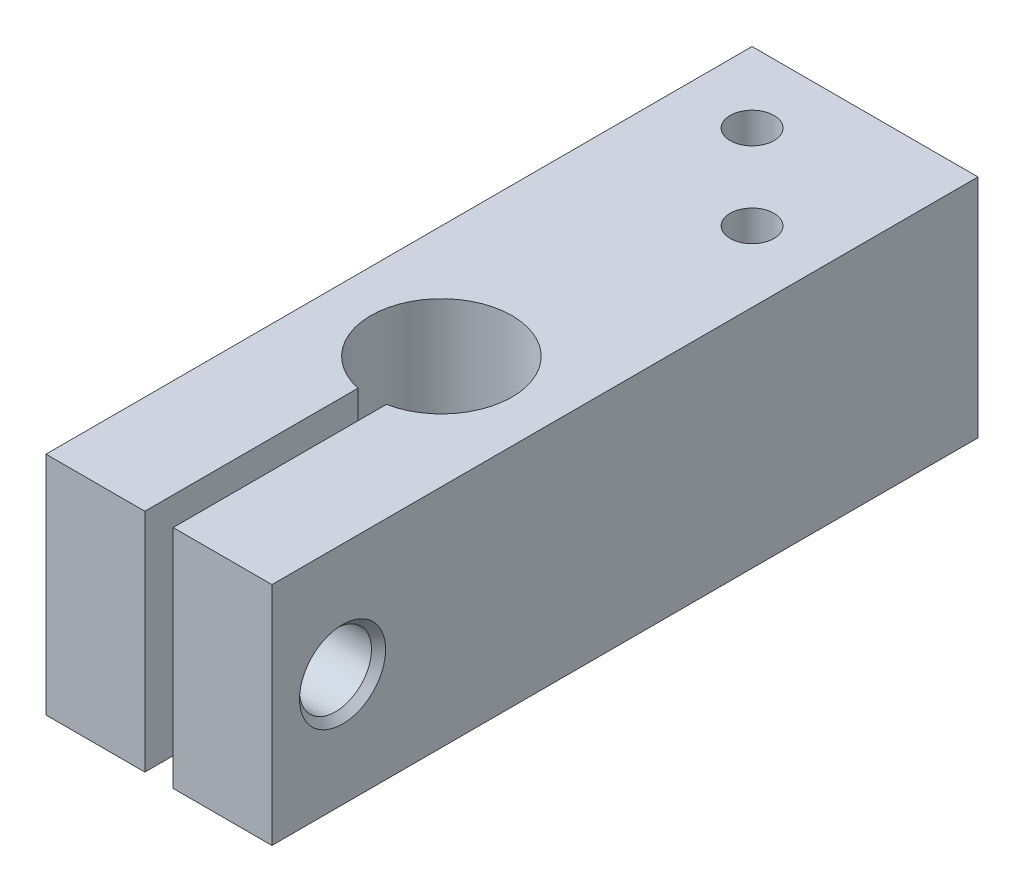
ISO-10303-21;
HEADER;
FILE_DESCRIPTION(('STEP AP214'),'2;1');
FILE_NAME('part.step','',(''),(''),'','','');
FILE_SCHEMA(('AUTOMOTIVE_DESIGN { 1 0 10303 214 1 1 1 1 }'));
ENDSEC;
DATA;
#1=APPLICATION_CONTEXT('core data for automotive mechanical design processes');
#2=APPLICATION_PROTOCOL_DEFINITION('international standard','automotive_design',2000,#1);
#3=PRODUCT_CONTEXT('',#1,'mechanical');
#4=PRODUCT('Part','Part','',(#3));
#5=PRODUCT_RELATED_PRODUCT_CATEGORY('part','',(#4));
#6=PRODUCT_DEFINITION_FORMATION('','',#4);
#7=PRODUCT_DEFINITION_CONTEXT('part definition',#1,'design');
#8=PRODUCT_DEFINITION('design','',#6,#7);
#9=PRODUCT_DEFINITION_SHAPE('','',#8);
#10=(LENGTH_UNIT() NAMED_UNIT(*) SI_UNIT(.MILLI.,.METRE.));
#11=(NAMED_UNIT(*) PLANE_ANGLE_UNIT() SI_UNIT($,.RADIAN.));
#12=(NAMED_UNIT(*) SI_UNIT($,.STERADIAN.) SOLID_ANGLE_UNIT());
#13=UNCERTAINTY_MEASURE_WITH_UNIT(LENGTH_MEASURE(1.E-05),#10,'distance_accuracy_value','');
#14=(GEOMETRIC_REPRESENTATION_CONTEXT(3) GLOBAL_UNCERTAINTY_ASSIGNED_CONTEXT((#13)) GLOBAL_UNIT_ASSIGNED_CONTEXT((#10,
#11,#12)) REPRESENTATION_CONTEXT('',''));
#15=CARTESIAN_POINT('',(0.,0.,0.));
#16=DIRECTION('',(0.,0.,1.));
#17=DIRECTION('',(1.,0.,0.));
#18=AXIS2_PLACEMENT_3D('',#15,#16,#17);
#19=CARTESIAN_POINT('',(0.,0.,50.));
#20=DIRECTION('',(0.,0.,1.));
#21=DIRECTION('',(1.,0.,0.));
#22=AXIS2_PLACEMENT_3D('',#19,#20,#21);
#23=PLANE('',#22);
#24=DIRECTION('',(1.,0.,0.));
#25=VECTOR('',#24,1.);
#26=CARTESIAN_POINT('',(8.,-8.,50.));
#27=LINE('',#26,#25);
#28=CARTESIAN_POINT('',(-8.,-8.,50.));
#29=VERTEX_POINT('',#28);
#30=CARTESIAN_POINT('',(-0.999999999999995,-8.,50.));
#31=VERTEX_POINT('',#30);
#32=EDGE_CURVE('E94',#29,#31,#27,.T.);
#33=ORIENTED_EDGE('',*,*,#32,.T.);
#34=DIRECTION('',(0.,1.,0.));
#35=VECTOR('',#34,1.);
#36=CARTESIAN_POINT('',(-0.999999999999995,-8.,50.));
#37=LINE('',#36,#35);
#38=CARTESIAN_POINT('',(-0.999999999999997,8.,50.));
#39=VERTEX_POINT('',#38);
#40=EDGE_CURVE('E119',#31,#39,#37,.T.);
#41=ORIENTED_EDGE('',*,*,#40,.T.);
#42=DIRECTION('',(-1.,0.,0.));
#43=VECTOR('',#42,1.);
#44=CARTESIAN_POINT('',(8.,8.,50.));
#45=LINE('',#44,#43);
#46=CARTESIAN_POINT('',(-8.,8.,50.));
#47=VERTEX_POINT('',#46);
#48=EDGE_CURVE('E64',#39,#47,#45,.T.);
#49=ORIENTED_EDGE('',*,*,#48,.T.);
#50=DIRECTION('',(0.,-1.,0.));
#51=VECTOR('',#50,1.);
#52=CARTESIAN_POINT('',(-8.,-8.,50.));
#53=LINE('',#52,#51);
#54=EDGE_CURVE('E150',#47,#29,#53,.T.);
#55=ORIENTED_EDGE('',*,*,#54,.T.);
#56=EDGE_LOOP('',(#33,#41,#49,#55));
#57=FACE_BOUND('',#56,.T.);
#58=ADVANCED_FACE('F40',(#57),#23,.T.);
#59=CARTESIAN_POINT('',(-8.,-8.,50.));
#60=DIRECTION('',(1.,0.,0.));
#61=DIRECTION('',(0.,0.,-1.));
#62=AXIS2_PLACEMENT_3D('',#59,#60,#61);
#63=PLANE('',#62);
#64=CARTESIAN_POINT('',(-8.,0.,45.));
#65=DIRECTION('',(-1.,0.,0.));
#66=DIRECTION('',(0.,0.,1.));
#67=AXIS2_PLACEMENT_3D('',#64,#65,#66);
#68=CIRCLE('',#67,2.1);
#69=CARTESIAN_POINT('',(-8.,0.,47.1));
#70=VERTEX_POINT('',#69);
#71=EDGE_CURVE('E253',#70,#70,#68,.T.);
#72=ORIENTED_EDGE('',*,*,#71,.F.);
#73=EDGE_LOOP('',(#72));
#74=FACE_BOUND('',#73,.T.);
#75=DIRECTION('',(0.,-1.,0.));
#76=VECTOR('',#75,1.);
#77=CARTESIAN_POINT('',(-8.,-8.,0.));
#78=LINE('',#77,#76);
#79=CARTESIAN_POINT('',(-8.,8.,0.));
#80=VERTEX_POINT('',#79);
#81=CARTESIAN_POINT('',(-8.,-8.,0.));
#82=VERTEX_POINT('',#81);
#83=EDGE_CURVE('E146',#80,#82,#78,.T.);
#84=ORIENTED_EDGE('',*,*,#83,.T.);
#85=DIRECTION('',(0.,0.,-1.));
#86=VECTOR('',#85,1.);
#87=CARTESIAN_POINT('',(-8.,-8.,50.));
#88=LINE('',#87,#86);
#89=EDGE_CURVE('E173',#29,#82,#88,.T.);
#90=ORIENTED_EDGE('',*,*,#89,.F.);
#91=ORIENTED_EDGE('',*,*,#54,.F.);
#92=DIRECTION('',(0.,0.,-1.));
#93=VECTOR('',#92,1.);
#94=CARTESIAN_POINT('',(-8.,8.,50.));
#95=LINE('',#94,#93);
#96=EDGE_CURVE('E159',#47,#80,#95,.T.);
#97=ORIENTED_EDGE('',*,*,#96,.T.);
#98=EDGE_LOOP('',(#84,#90,#91,#97));
#99=FACE_BOUND('',#98,.T.);
#100=ADVANCED_FACE('F193',(#74,#99),#63,.F.);
#101=CARTESIAN_POINT('',(8.,-8.,50.));
#102=DIRECTION('',(0.,1.,0.));
#103=DIRECTION('',(-1.,0.,0.));
#104=AXIS2_PLACEMENT_3D('',#101,#102,#103);
#105=PLANE('',#104);
#106=CARTESIAN_POINT('',(3.,-8.,11.));
#107=DIRECTION('',(0.,-1.,0.));
#108=DIRECTION('',(1.,0.,0.));
#109=AXIS2_PLACEMENT_3D('',#106,#107,#108);
#110=CIRCLE('',#109,1.55);
#111=CARTESIAN_POINT('',(4.55,-8.,11.));
#112=VERTEX_POINT('',#111);
#113=EDGE_CURVE('E249',#112,#112,#110,.T.);
#114=ORIENTED_EDGE('',*,*,#113,.F.);
#115=EDGE_LOOP('',(#114));
#116=FACE_BOUND('',#115,.T.);
#117=CARTESIAN_POINT('',(-3.,-8.,5.));
#118=DIRECTION('',(0.,-1.,0.));
#119=DIRECTION('',(1.,0.,0.));
#120=AXIS2_PLACEMENT_3D('',#117,#118,#119);
#121=CIRCLE('',#120,1.55);
#122=CARTESIAN_POINT('',(-1.45,-8.,5.));
#123=VERTEX_POINT('',#122);
#124=EDGE_CURVE('E256',#123,#123,#121,.T.);
#125=ORIENTED_EDGE('',*,*,#124,.F.);
#126=EDGE_LOOP('',(#125));
#127=FACE_BOUND('',#126,.T.);
#128=CARTESIAN_POINT('',(1.00000000000001,-8.,50.));
#129=VERTEX_POINT('',#128);
#130=CARTESIAN_POINT('',(8.,-8.,50.));
#131=VERTEX_POINT('',#130);
#132=EDGE_CURVE('E152',#129,#131,#27,.T.);
#133=ORIENTED_EDGE('',*,*,#132,.F.);
#134=DIRECTION('',(0.,0.,-1.));
#135=VECTOR('',#134,1.);
#136=CARTESIAN_POINT('',(1.00000000000001,-8.,0.));
#137=LINE('',#136,#135);
#138=CARTESIAN_POINT('',(1.00000000000001,-8.,34.8989794855664));
#139=VERTEX_POINT('',#138);
#140=EDGE_CURVE('E121',#129,#139,#137,.T.);
#141=ORIENTED_EDGE('',*,*,#140,.T.);
#142=CARTESIAN_POINT('',(0.,-8.,30.));
#143=DIRECTION('',(0.,1.,0.));
#144=DIRECTION('',(-1.,0.,0.));
#145=AXIS2_PLACEMENT_3D('',#142,#143,#144);
#146=CIRCLE('',#145,5.);
#147=CARTESIAN_POINT('',(-0.999999999999997,-8.,34.8989794855664));
#148=VERTEX_POINT('',#147);
#149=EDGE_CURVE('E122',#139,#148,#146,.T.);
#150=ORIENTED_EDGE('',*,*,#149,.T.);
#151=DIRECTION('',(0.,0.,-1.));
#152=VECTOR('',#151,1.);
#153=CARTESIAN_POINT('',(-1.,-8.,0.));
#154=LINE('',#153,#152);
#155=EDGE_CURVE('E114',#31,#148,#154,.T.);
#156=ORIENTED_EDGE('',*,*,#155,.F.);
#157=ORIENTED_EDGE('',*,*,#32,.F.);
#158=ORIENTED_EDGE('',*,*,#89,.T.);
#159=DIRECTION('',(1.,0.,0.));
#160=VECTOR('',#159,1.);
#161=CARTESIAN_POINT('',(8.,-8.,0.));
#162=LINE('',#161,#160);
#163=CARTESIAN_POINT('',(8.,-8.,0.));
#164=VERTEX_POINT('',#163);
#165=EDGE_CURVE('E162',#82,#164,#162,.T.);
#166=ORIENTED_EDGE('',*,*,#165,.T.);
#167=DIRECTION('',(0.,0.,-1.));
#168=VECTOR('',#167,1.);
#169=CARTESIAN_POINT('',(8.,-8.,50.));
#170=LINE('',#169,#168);
#171=EDGE_CURVE('E170',#131,#164,#170,.T.);
#172=ORIENTED_EDGE('',*,*,#171,.F.);
#173=EDGE_LOOP('',(#133,#141,#150,#156,#157,#158,#166,#172));
#174=FACE_BOUND('',#173,.T.);
#175=ADVANCED_FACE('F132',(#116,#127,#174),#105,.F.);
#176=CARTESIAN_POINT('',(8.,-8.,50.));
#177=DIRECTION('',(-1.,0.,0.));
#178=DIRECTION('',(0.,0.,1.));
#179=AXIS2_PLACEMENT_3D('',#176,#177,#178);
#180=PLANE('',#179);
#181=CARTESIAN_POINT('',(8.,0.,45.));
#182=DIRECTION('',(-1.,0.,0.));
#183=DIRECTION('',(0.,0.,1.));
#184=AXIS2_PLACEMENT_3D('',#181,#182,#183);
#185=CIRCLE('',#184,3.04999999999999);
#186=CARTESIAN_POINT('',(8.,0.,48.05));
#187=VERTEX_POINT('',#186);
#188=EDGE_CURVE('E11',#187,#187,#185,.T.);
#189=ORIENTED_EDGE('',*,*,#188,.T.);
#190=EDGE_LOOP('',(#189));
#191=FACE_BOUND('',#190,.T.);
#192=DIRECTION('',(0.,1.,0.));
#193=VECTOR('',#192,1.);
#194=CARTESIAN_POINT('',(8.,-8.,0.));
#195=LINE('',#194,#193);
#196=CARTESIAN_POINT('',(8.,8.,0.));
#197=VERTEX_POINT('',#196);
#198=EDGE_CURVE('E164',#164,#197,#195,.T.);
#199=ORIENTED_EDGE('',*,*,#198,.T.);
#200=DIRECTION('',(0.,0.,-1.));
#201=VECTOR('',#200,1.);
#202=CARTESIAN_POINT('',(8.,8.,50.));
#203=LINE('',#202,#201);
#204=CARTESIAN_POINT('',(8.,8.,50.));
#205=VERTEX_POINT('',#204);
#206=EDGE_CURVE('E168',#205,#197,#203,.T.);
#207=ORIENTED_EDGE('',*,*,#206,.F.);
#208=DIRECTION('',(0.,1.,0.));
#209=VECTOR('',#208,1.);
#210=CARTESIAN_POINT('',(8.,-8.,50.));
#211=LINE('',#210,#209);
#212=EDGE_CURVE('E154',#131,#205,#211,.T.);
#213=ORIENTED_EDGE('',*,*,#212,.F.);
#214=ORIENTED_EDGE('',*,*,#171,.T.);
#215=EDGE_LOOP('',(#199,#207,#213,#214));
#216=FACE_BOUND('',#215,.T.);
#217=ADVANCED_FACE('F211',(#191,#216),#180,.F.);
#218=CARTESIAN_POINT('',(8.,8.,50.));
#219=DIRECTION('',(0.,-1.,0.));
#220=DIRECTION('',(1.,0.,0.));
#221=AXIS2_PLACEMENT_3D('',#218,#219,#220);
#222=PLANE('',#221);
#223=CARTESIAN_POINT('',(3.,8.,11.));
#224=DIRECTION('',(0.,-1.,0.));
#225=DIRECTION('',(1.,0.,0.));
#226=AXIS2_PLACEMENT_3D('',#223,#224,#225);
#227=CIRCLE('',#226,1.55);
#228=CARTESIAN_POINT('',(4.55,8.,11.));
#229=VERTEX_POINT('',#228);
#230=EDGE_CURVE('E246',#229,#229,#227,.T.);
#231=ORIENTED_EDGE('',*,*,#230,.T.);
#232=EDGE_LOOP('',(#231));
#233=FACE_BOUND('',#232,.T.);
#234=CARTESIAN_POINT('',(-3.,8.,5.));
#235=DIRECTION('',(0.,-1.,0.));
#236=DIRECTION('',(1.,0.,0.));
#237=AXIS2_PLACEMENT_3D('',#234,#235,#236);
#238=CIRCLE('',#237,1.55);
#239=CARTESIAN_POINT('',(-1.45,8.,5.));
#240=VERTEX_POINT('',#239);
#241=EDGE_CURVE('E251',#240,#240,#238,.T.);
#242=ORIENTED_EDGE('',*,*,#241,.T.);
#243=EDGE_LOOP('',(#242));
#244=FACE_BOUND('',#243,.T.);
#245=CARTESIAN_POINT('',(0.,8.,30.));
#246=DIRECTION('',(0.,1.,0.));
#247=DIRECTION('',(-1.,0.,0.));
#248=AXIS2_PLACEMENT_3D('',#245,#246,#247);
#249=CIRCLE('',#248,5.);
#250=CARTESIAN_POINT('',(1.,8.,34.8989794855664));
#251=VERTEX_POINT('',#250);
#252=CARTESIAN_POINT('',(-0.999999999999998,8.,34.8989794855664));
#253=VERTEX_POINT('',#252);
#254=EDGE_CURVE('E129',#251,#253,#249,.T.);
#255=ORIENTED_EDGE('',*,*,#254,.F.);
#256=DIRECTION('',(0.,0.,-1.));
#257=VECTOR('',#256,1.);
#258=CARTESIAN_POINT('',(1.00000000000001,8.,0.));
#259=LINE('',#258,#257);
#260=CARTESIAN_POINT('',(1.00000000000001,8.,50.));
#261=VERTEX_POINT('',#260);
#262=EDGE_CURVE('E133',#261,#251,#259,.T.);
#263=ORIENTED_EDGE('',*,*,#262,.F.);
#264=EDGE_CURVE('E156',#205,#261,#45,.T.);
#265=ORIENTED_EDGE('',*,*,#264,.F.);
#266=ORIENTED_EDGE('',*,*,#206,.T.);
#267=DIRECTION('',(-1.,0.,0.));
#268=VECTOR('',#267,1.);
#269=CARTESIAN_POINT('',(8.,8.,0.));
#270=LINE('',#269,#268);
#271=EDGE_CURVE('E86',#197,#80,#270,.T.);
#272=ORIENTED_EDGE('',*,*,#271,.T.);
#273=ORIENTED_EDGE('',*,*,#96,.F.);
#274=ORIENTED_EDGE('',*,*,#48,.F.);
#275=DIRECTION('',(0.,0.,-1.));
#276=VECTOR('',#275,1.);
#277=CARTESIAN_POINT('',(-1.00000000000001,8.,0.));
#278=LINE('',#277,#276);
#279=EDGE_CURVE('E56',#39,#253,#278,.T.);
#280=ORIENTED_EDGE('',*,*,#279,.T.);
#281=EDGE_LOOP('',(#255,#263,#265,#266,#272,#273,#274,#280));
#282=FACE_BOUND('',#281,.T.);
#283=ADVANCED_FACE('F204',(#233,#244,#282),#222,.F.);
#284=DIRECTION('',(0.,1.,0.));
#285=VECTOR('',#284,1.);
#286=CARTESIAN_POINT('',(1.00000000000001,-8.,50.));
#287=LINE('',#286,#285);
#288=EDGE_CURVE('E147',#129,#261,#287,.T.);
#289=ORIENTED_EDGE('',*,*,#288,.F.);
#290=ORIENTED_EDGE('',*,*,#132,.T.);
#291=ORIENTED_EDGE('',*,*,#212,.T.);
#292=ORIENTED_EDGE('',*,*,#264,.T.);
#293=EDGE_LOOP('',(#289,#290,#291,#292));
#294=FACE_BOUND('',#293,.T.);
#295=ADVANCED_FACE('F195',(#294),#23,.T.);
#296=CARTESIAN_POINT('',(0.,0.,0.));
#297=DIRECTION('',(0.,0.,1.));
#298=DIRECTION('',(1.,0.,0.));
#299=AXIS2_PLACEMENT_3D('',#296,#297,#298);
#300=PLANE('',#299);
#301=ORIENTED_EDGE('',*,*,#83,.F.);
#302=ORIENTED_EDGE('',*,*,#271,.F.);
#303=ORIENTED_EDGE('',*,*,#198,.F.);
#304=ORIENTED_EDGE('',*,*,#165,.F.);
#305=EDGE_LOOP('',(#301,#302,#303,#304));
#306=FACE_BOUND('',#305,.T.);
#307=ADVANCED_FACE('F203',(#306),#300,.F.);
#308=CARTESIAN_POINT('',(0.,-8.,30.));
#309=DIRECTION('',(0.,1.,0.));
#310=DIRECTION('',(-1.,0.,0.));
#311=AXIS2_PLACEMENT_3D('',#308,#309,#310);
#312=CYLINDRICAL_SURFACE('',#311,5.);
#313=ORIENTED_EDGE('',*,*,#254,.T.);
#314=DIRECTION('',(0.,1.,0.));
#315=VECTOR('',#314,1.);
#316=CARTESIAN_POINT('',(-0.999999999999997,-8.,34.8989794855664));
#317=LINE('',#316,#315);
#318=EDGE_CURVE('E117',#148,#253,#317,.T.);
#319=ORIENTED_EDGE('',*,*,#318,.F.);
#320=ORIENTED_EDGE('',*,*,#149,.F.);
#321=DIRECTION('',(0.,1.,0.));
#322=VECTOR('',#321,1.);
#323=CARTESIAN_POINT('',(1.00000000000001,-8.,34.8989794855664));
#324=LINE('',#323,#322);
#325=EDGE_CURVE('E144',#139,#251,#324,.T.);
#326=ORIENTED_EDGE('',*,*,#325,.T.);
#327=EDGE_LOOP('',(#313,#319,#320,#326));
#328=FACE_BOUND('',#327,.T.);
#329=ADVANCED_FACE('F126',(#328),#312,.F.);
#330=CARTESIAN_POINT('',(1.00000000000001,-8.,0.));
#331=DIRECTION('',(1.,0.,0.));
#332=DIRECTION('',(0.,1.,0.));
#333=AXIS2_PLACEMENT_3D('',#330,#331,#332);
#334=PLANE('',#333);
#335=CARTESIAN_POINT('',(1.,0.,45.));
#336=DIRECTION('',(1.,0.,0.));
#337=DIRECTION('',(0.,1.,0.));
#338=AXIS2_PLACEMENT_3D('',#335,#336,#337);
#339=CIRCLE('',#338,2.55);
#340=CARTESIAN_POINT('',(1.,2.55,45.));
#341=VERTEX_POINT('',#340);
#342=EDGE_CURVE('E138',#341,#341,#339,.F.);
#343=ORIENTED_EDGE('',*,*,#342,.F.);
#344=EDGE_LOOP('',(#343));
#345=FACE_BOUND('',#344,.T.);
#346=ORIENTED_EDGE('',*,*,#262,.T.);
#347=ORIENTED_EDGE('',*,*,#325,.F.);
#348=ORIENTED_EDGE('',*,*,#140,.F.);
#349=ORIENTED_EDGE('',*,*,#288,.T.);
#350=EDGE_LOOP('',(#346,#347,#348,#349));
#351=FACE_BOUND('',#350,.T.);
#352=ADVANCED_FACE('F223',(#345,#351),#334,.F.);
#353=CARTESIAN_POINT('',(-1.,-8.,0.));
#354=DIRECTION('',(1.,0.,0.));
#355=DIRECTION('',(0.,0.,-1.));
#356=AXIS2_PLACEMENT_3D('',#353,#354,#355);
#357=PLANE('',#356);
#358=CARTESIAN_POINT('',(-0.999999999999995,0.,45.));
#359=DIRECTION('',(1.,0.,0.));
#360=DIRECTION('',(0.,0.,-1.));
#361=AXIS2_PLACEMENT_3D('',#358,#359,#360);
#362=CIRCLE('',#361,2.1);
#363=CARTESIAN_POINT('',(-0.999999999999995,0.,42.9));
#364=VERTEX_POINT('',#363);
#365=EDGE_CURVE('E262',#364,#364,#362,.T.);
#366=ORIENTED_EDGE('',*,*,#365,.F.);
#367=EDGE_LOOP('',(#366));
#368=FACE_BOUND('',#367,.T.);
#369=ORIENTED_EDGE('',*,*,#279,.F.);
#370=ORIENTED_EDGE('',*,*,#40,.F.);
#371=ORIENTED_EDGE('',*,*,#155,.T.);
#372=ORIENTED_EDGE('',*,*,#318,.T.);
#373=EDGE_LOOP('',(#369,#370,#371,#372));
#374=FACE_BOUND('',#373,.T.);
#375=ADVANCED_FACE('F116',(#368,#374),#357,.T.);
#376=CARTESIAN_POINT('',(-8.001,0.,45.));
#377=DIRECTION('',(1.,0.,0.));
#378=DIRECTION('',(0.,0.,-1.));
#379=AXIS2_PLACEMENT_3D('',#376,#377,#378);
#380=CYLINDRICAL_SURFACE('',#379,2.55);
#381=CARTESIAN_POINT('',(7.50000000000002,0.,45.));
#382=DIRECTION('',(-1.,0.,0.));
#383=DIRECTION('',(0.,0.,1.));
#384=AXIS2_PLACEMENT_3D('',#381,#382,#383);
#385=CIRCLE('',#384,2.55);
#386=CARTESIAN_POINT('',(7.50000000000002,0.,47.55));
#387=VERTEX_POINT('',#386);
#388=EDGE_CURVE('E49',#387,#387,#385,.F.);
#389=ORIENTED_EDGE('',*,*,#388,.T.);
#390=EDGE_LOOP('',(#389));
#391=FACE_BOUND('',#390,.T.);
#392=ORIENTED_EDGE('',*,*,#342,.T.);
#393=EDGE_LOOP('',(#392));
#394=FACE_BOUND('',#393,.T.);
#395=ADVANCED_FACE('F177',(#391,#394),#380,.F.);
#396=CARTESIAN_POINT('',(7.50000000000002,0.,45.));
#397=DIRECTION('',(1.,0.,0.));
#398=DIRECTION('',(0.,0.,-1.));
#399=AXIS2_PLACEMENT_3D('',#396,#397,#398);
#400=CONICAL_SURFACE('',#399,2.55,0.785398163397453);
#401=ORIENTED_EDGE('',*,*,#188,.F.);
#402=EDGE_LOOP('',(#401));
#403=FACE_BOUND('',#402,.T.);
#404=ORIENTED_EDGE('',*,*,#388,.F.);
#405=EDGE_LOOP('',(#404));
#406=FACE_BOUND('',#405,.T.);
#407=ADVANCED_FACE('F43',(#403,#406),#400,.F.);
#408=CARTESIAN_POINT('',(-8.,0.,45.));
#409=DIRECTION('',(-1.,0.,0.));
#410=DIRECTION('',(0.,0.,1.));
#411=AXIS2_PLACEMENT_3D('',#408,#409,#410);
#412=CYLINDRICAL_SURFACE('',#411,2.1);
#413=ORIENTED_EDGE('',*,*,#365,.T.);
#414=EDGE_LOOP('',(#413));
#415=FACE_BOUND('',#414,.T.);
#416=ORIENTED_EDGE('',*,*,#71,.T.);
#417=EDGE_LOOP('',(#416));
#418=FACE_BOUND('',#417,.T.);
#419=ADVANCED_FACE('F181',(#415,#418),#412,.F.);
#420=CARTESIAN_POINT('',(-3.,8.,5.));
#421=DIRECTION('',(0.,-1.,0.));
#422=DIRECTION('',(1.,0.,0.));
#423=AXIS2_PLACEMENT_3D('',#420,#421,#422);
#424=CYLINDRICAL_SURFACE('',#423,1.55);
#425=ORIENTED_EDGE('',*,*,#241,.F.);
#426=EDGE_LOOP('',(#425));
#427=FACE_BOUND('',#426,.T.);
#428=ORIENTED_EDGE('',*,*,#124,.T.);
#429=EDGE_LOOP('',(#428));
#430=FACE_BOUND('',#429,.T.);
#431=ADVANCED_FACE('F187',(#427,#430),#424,.F.);
#432=CARTESIAN_POINT('',(3.,8.,11.));
#433=DIRECTION('',(0.,-1.,0.));
#434=DIRECTION('',(1.,0.,0.));
#435=AXIS2_PLACEMENT_3D('',#432,#433,#434);
#436=CYLINDRICAL_SURFACE('',#435,1.55);
#437=ORIENTED_EDGE('',*,*,#230,.F.);
#438=EDGE_LOOP('',(#437));
#439=FACE_BOUND('',#438,.T.);
#440=ORIENTED_EDGE('',*,*,#113,.T.);
#441=EDGE_LOOP('',(#440));
#442=FACE_BOUND('',#441,.T.);
#443=ADVANCED_FACE('F237',(#439,#442),#436,.F.);
#444=CLOSED_SHELL('',(#58,#100,#175,#217,#283,#295,#307,#329,#352,#375,#395,#407,#419,#431,#443));
#445=MANIFOLD_SOLID_BREP('B2',#444);
#446=ADVANCED_BREP_SHAPE_REPRESENTATION('',(#18,#445),#14);
#447=SHAPE_DEFINITION_REPRESENTATION(#9,#446);
ENDSEC;
END-ISO-10303-21;
